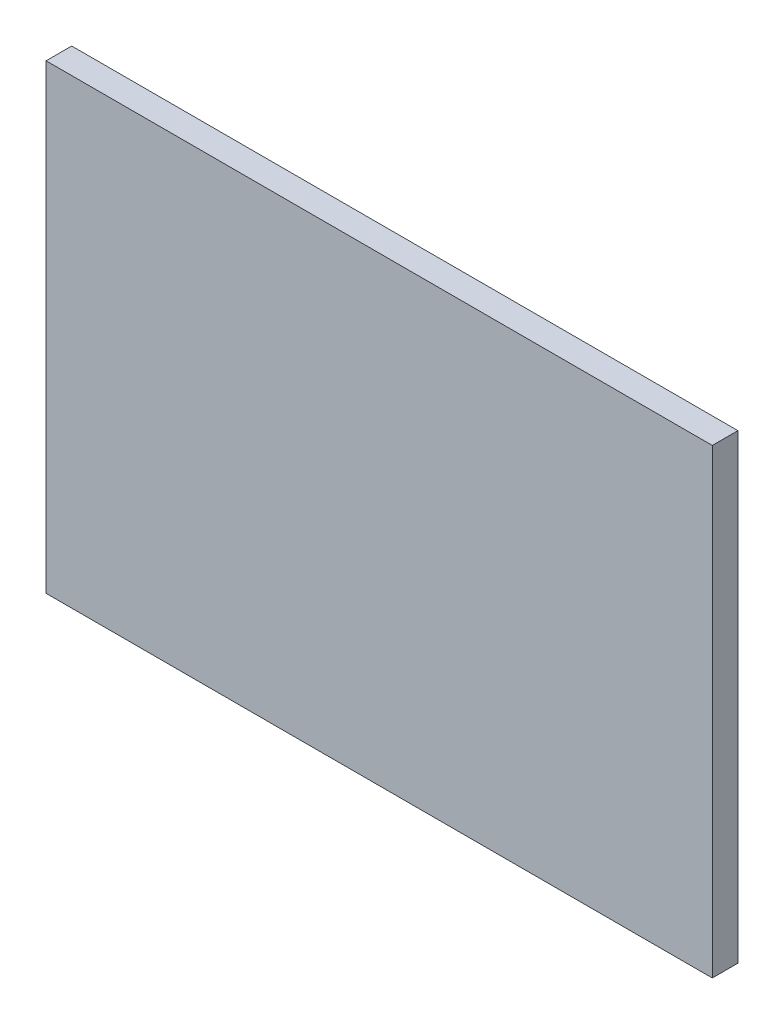
ISO-10303-21;
HEADER;
FILE_DESCRIPTION(('STEP AP214'),'2;1');
FILE_NAME('part.step','',(''),(''),'','','');
FILE_SCHEMA(('AUTOMOTIVE_DESIGN { 1 0 10303 214 1 1 1 1 }'));
ENDSEC;
DATA;
#1=APPLICATION_CONTEXT('core data for automotive mechanical design processes');
#2=APPLICATION_PROTOCOL_DEFINITION('international standard','automotive_design',2000,#1);
#3=PRODUCT_CONTEXT('',#1,'mechanical');
#4=PRODUCT('Part','Part','',(#3));
#5=PRODUCT_RELATED_PRODUCT_CATEGORY('part','',(#4));
#6=PRODUCT_DEFINITION_FORMATION('','',#4);
#7=PRODUCT_DEFINITION_CONTEXT('part definition',#1,'design');
#8=PRODUCT_DEFINITION('design','',#6,#7);
#9=PRODUCT_DEFINITION_SHAPE('','',#8);
#10=(LENGTH_UNIT() NAMED_UNIT(*) SI_UNIT(.MILLI.,.METRE.));
#11=(NAMED_UNIT(*) PLANE_ANGLE_UNIT() SI_UNIT($,.RADIAN.));
#12=(NAMED_UNIT(*) SI_UNIT($,.STERADIAN.) SOLID_ANGLE_UNIT());
#13=UNCERTAINTY_MEASURE_WITH_UNIT(LENGTH_MEASURE(1.E-05),#10,'distance_accuracy_value','');
#14=(GEOMETRIC_REPRESENTATION_CONTEXT(3) GLOBAL_UNCERTAINTY_ASSIGNED_CONTEXT((#13)) GLOBAL_UNIT_ASSIGNED_CONTEXT((#10,
#11,#12)) REPRESENTATION_CONTEXT('',''));
#15=CARTESIAN_POINT('',(0.,0.,0.));
#16=DIRECTION('',(0.,0.,1.));
#17=DIRECTION('',(1.,0.,0.));
#18=AXIS2_PLACEMENT_3D('',#15,#16,#17);
#19=CARTESIAN_POINT('',(13.,-9.,-1.));
#20=DIRECTION('',(1.,0.,0.));
#21=DIRECTION('',(0.,0.,-1.));
#22=AXIS2_PLACEMENT_3D('',#19,#20,#21);
#23=PLANE('',#22);
#24=DIRECTION('',(0.,1.,0.));
#25=VECTOR('',#24,1.);
#26=CARTESIAN_POINT('',(13.,-9.,0.));
#27=LINE('',#26,#25);
#28=CARTESIAN_POINT('',(13.,-9.,0.));
#29=VERTEX_POINT('',#28);
#30=CARTESIAN_POINT('',(13.,9.,0.));
#31=VERTEX_POINT('',#30);
#32=EDGE_CURVE('E112',#29,#31,#27,.T.);
#33=ORIENTED_EDGE('',*,*,#32,.F.);
#34=DIRECTION('',(0.,0.,1.));
#35=VECTOR('',#34,1.);
#36=CARTESIAN_POINT('',(13.,-9.,-1.));
#37=LINE('',#36,#35);
#38=CARTESIAN_POINT('',(13.,-9.,-1.));
#39=VERTEX_POINT('',#38);
#40=EDGE_CURVE('E11',#39,#29,#37,.T.);
#41=ORIENTED_EDGE('',*,*,#40,.F.);
#42=DIRECTION('',(0.,1.,0.));
#43=VECTOR('',#42,1.);
#44=CARTESIAN_POINT('',(13.,-9.,-1.));
#45=LINE('',#44,#43);
#46=CARTESIAN_POINT('',(13.,9.,-1.));
#47=VERTEX_POINT('',#46);
#48=EDGE_CURVE('E104',#39,#47,#45,.T.);
#49=ORIENTED_EDGE('',*,*,#48,.T.);
#50=DIRECTION('',(0.,0.,1.));
#51=VECTOR('',#50,1.);
#52=CARTESIAN_POINT('',(13.,9.,-1.));
#53=LINE('',#52,#51);
#54=EDGE_CURVE('E45',#47,#31,#53,.T.);
#55=ORIENTED_EDGE('',*,*,#54,.T.);
#56=EDGE_LOOP('',(#33,#41,#49,#55));
#57=FACE_BOUND('',#56,.T.);
#58=ADVANCED_FACE('F42',(#57),#23,.T.);
#59=CARTESIAN_POINT('',(-13.,-9.,-1.));
#60=DIRECTION('',(0.,-1.,0.));
#61=DIRECTION('',(0.,0.,-1.));
#62=AXIS2_PLACEMENT_3D('',#59,#60,#61);
#63=PLANE('',#62);
#64=DIRECTION('',(1.,0.,0.));
#65=VECTOR('',#64,1.);
#66=CARTESIAN_POINT('',(-13.,-9.,0.));
#67=LINE('',#66,#65);
#68=CARTESIAN_POINT('',(-13.,-9.,0.));
#69=VERTEX_POINT('',#68);
#70=EDGE_CURVE('E107',#69,#29,#67,.T.);
#71=ORIENTED_EDGE('',*,*,#70,.F.);
#72=DIRECTION('',(0.,0.,1.));
#73=VECTOR('',#72,1.);
#74=CARTESIAN_POINT('',(-13.,-9.,-1.));
#75=LINE('',#74,#73);
#76=CARTESIAN_POINT('',(-13.,-9.,-1.));
#77=VERTEX_POINT('',#76);
#78=EDGE_CURVE('E52',#77,#69,#75,.T.);
#79=ORIENTED_EDGE('',*,*,#78,.F.);
#80=DIRECTION('',(1.,0.,0.));
#81=VECTOR('',#80,1.);
#82=CARTESIAN_POINT('',(-13.,-9.,-1.));
#83=LINE('',#82,#81);
#84=EDGE_CURVE('E99',#77,#39,#83,.T.);
#85=ORIENTED_EDGE('',*,*,#84,.T.);
#86=ORIENTED_EDGE('',*,*,#40,.T.);
#87=EDGE_LOOP('',(#71,#79,#85,#86));
#88=FACE_BOUND('',#87,.T.);
#89=ADVANCED_FACE('F128',(#88),#63,.T.);
#90=CARTESIAN_POINT('',(-13.,-9.,-1.));
#91=DIRECTION('',(-1.,0.,0.));
#92=DIRECTION('',(0.,0.,1.));
#93=AXIS2_PLACEMENT_3D('',#90,#91,#92);
#94=PLANE('',#93);
#95=DIRECTION('',(0.,-1.,0.));
#96=VECTOR('',#95,1.);
#97=CARTESIAN_POINT('',(-13.,-9.,0.));
#98=LINE('',#97,#96);
#99=CARTESIAN_POINT('',(-13.,9.,0.));
#100=VERTEX_POINT('',#99);
#101=EDGE_CURVE('E93',#100,#69,#98,.T.);
#102=ORIENTED_EDGE('',*,*,#101,.F.);
#103=DIRECTION('',(0.,0.,1.));
#104=VECTOR('',#103,1.);
#105=CARTESIAN_POINT('',(-13.,9.,-1.));
#106=LINE('',#105,#104);
#107=CARTESIAN_POINT('',(-13.,9.,-1.));
#108=VERTEX_POINT('',#107);
#109=EDGE_CURVE('E88',#108,#100,#106,.T.);
#110=ORIENTED_EDGE('',*,*,#109,.F.);
#111=DIRECTION('',(0.,-1.,0.));
#112=VECTOR('',#111,1.);
#113=CARTESIAN_POINT('',(-13.,-9.,-1.));
#114=LINE('',#113,#112);
#115=EDGE_CURVE('E91',#108,#77,#114,.T.);
#116=ORIENTED_EDGE('',*,*,#115,.T.);
#117=ORIENTED_EDGE('',*,*,#78,.T.);
#118=EDGE_LOOP('',(#102,#110,#116,#117));
#119=FACE_BOUND('',#118,.T.);
#120=ADVANCED_FACE('F90',(#119),#94,.T.);
#121=CARTESIAN_POINT('',(-13.,9.,-1.));
#122=DIRECTION('',(0.,1.,0.));
#123=DIRECTION('',(0.,0.,1.));
#124=AXIS2_PLACEMENT_3D('',#121,#122,#123);
#125=PLANE('',#124);
#126=DIRECTION('',(-1.,0.,0.));
#127=VECTOR('',#126,1.);
#128=CARTESIAN_POINT('',(-13.,9.,0.));
#129=LINE('',#128,#127);
#130=EDGE_CURVE('E116',#31,#100,#129,.T.);
#131=ORIENTED_EDGE('',*,*,#130,.F.);
#132=ORIENTED_EDGE('',*,*,#54,.F.);
#133=DIRECTION('',(-1.,0.,0.));
#134=VECTOR('',#133,1.);
#135=CARTESIAN_POINT('',(-13.,9.,-1.));
#136=LINE('',#135,#134);
#137=EDGE_CURVE('E98',#47,#108,#136,.T.);
#138=ORIENTED_EDGE('',*,*,#137,.T.);
#139=ORIENTED_EDGE('',*,*,#109,.T.);
#140=EDGE_LOOP('',(#131,#132,#138,#139));
#141=FACE_BOUND('',#140,.T.);
#142=ADVANCED_FACE('F102',(#141),#125,.T.);
#143=CARTESIAN_POINT('',(0.,0.,-1.));
#144=DIRECTION('',(0.,0.,-1.));
#145=DIRECTION('',(-1.,0.,0.));
#146=AXIS2_PLACEMENT_3D('',#143,#144,#145);
#147=PLANE('',#146);
#148=ORIENTED_EDGE('',*,*,#48,.F.);
#149=ORIENTED_EDGE('',*,*,#84,.F.);
#150=ORIENTED_EDGE('',*,*,#115,.F.);
#151=ORIENTED_EDGE('',*,*,#137,.F.);
#152=EDGE_LOOP('',(#148,#149,#150,#151));
#153=FACE_BOUND('',#152,.T.);
#154=ADVANCED_FACE('F97',(#153),#147,.T.);
#155=CARTESIAN_POINT('',(0.,0.,0.));
#156=DIRECTION('',(0.,0.,-1.));
#157=DIRECTION('',(-1.,0.,0.));
#158=AXIS2_PLACEMENT_3D('',#155,#156,#157);
#159=PLANE('',#158);
#160=ORIENTED_EDGE('',*,*,#32,.T.);
#161=ORIENTED_EDGE('',*,*,#130,.T.);
#162=ORIENTED_EDGE('',*,*,#101,.T.);
#163=ORIENTED_EDGE('',*,*,#70,.T.);
#164=EDGE_LOOP('',(#160,#161,#162,#163));
#165=FACE_BOUND('',#164,.T.);
#166=ADVANCED_FACE('F127',(#165),#159,.F.);
#167=CLOSED_SHELL('',(#58,#89,#120,#142,#154,#166));
#168=MANIFOLD_SOLID_BREP('B2',#167);
#169=ADVANCED_BREP_SHAPE_REPRESENTATION('',(#18,#168),#14);
#170=SHAPE_DEFINITION_REPRESENTATION(#9,#169);
ENDSEC;
END-ISO-10303-21;
